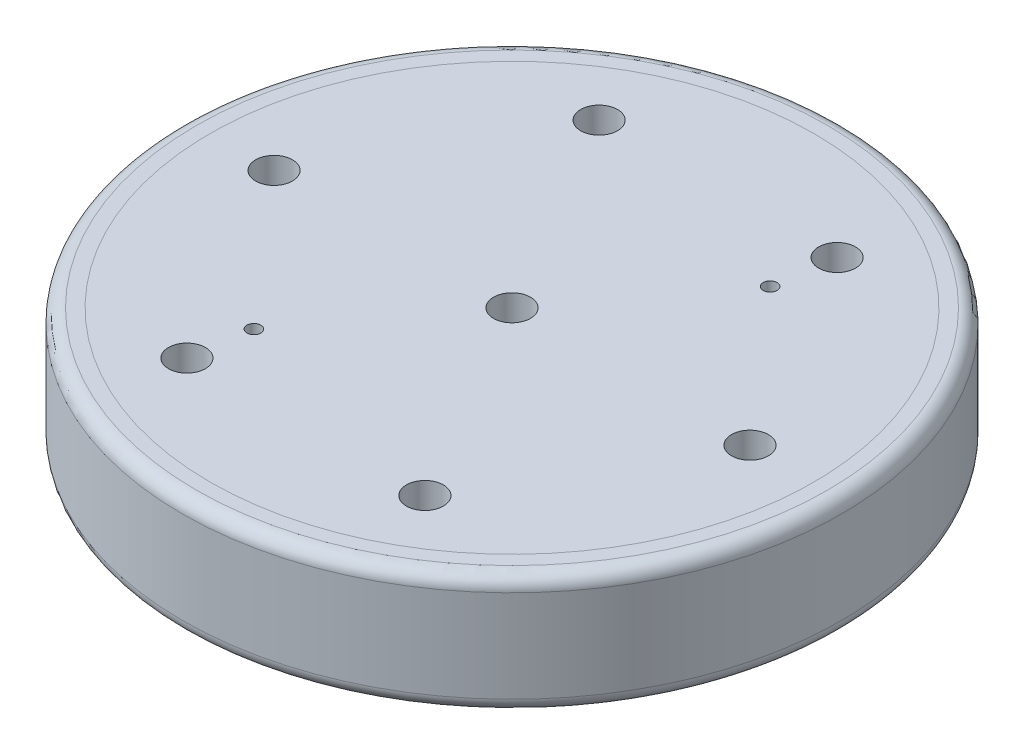
ISO-10303-21;
HEADER;
FILE_DESCRIPTION(('STEP AP214'),'2;1');
FILE_NAME('part.step','',(''),(''),'','','');
FILE_SCHEMA(('AUTOMOTIVE_DESIGN { 1 0 10303 214 1 1 1 1 }'));
ENDSEC;
DATA;
#1=APPLICATION_CONTEXT('core data for automotive mechanical design processes');
#2=APPLICATION_PROTOCOL_DEFINITION('international standard','automotive_design',2000,#1);
#3=PRODUCT_CONTEXT('',#1,'mechanical');
#4=PRODUCT('Part','Part','',(#3));
#5=PRODUCT_RELATED_PRODUCT_CATEGORY('part','',(#4));
#6=PRODUCT_DEFINITION_FORMATION('','',#4);
#7=PRODUCT_DEFINITION_CONTEXT('part definition',#1,'design');
#8=PRODUCT_DEFINITION('design','',#6,#7);
#9=PRODUCT_DEFINITION_SHAPE('','',#8);
#10=(LENGTH_UNIT() NAMED_UNIT(*) SI_UNIT(.MILLI.,.METRE.));
#11=(NAMED_UNIT(*) PLANE_ANGLE_UNIT() SI_UNIT($,.RADIAN.));
#12=(NAMED_UNIT(*) SI_UNIT($,.STERADIAN.) SOLID_ANGLE_UNIT());
#13=UNCERTAINTY_MEASURE_WITH_UNIT(LENGTH_MEASURE(1.E-05),#10,'distance_accuracy_value','');
#14=(GEOMETRIC_REPRESENTATION_CONTEXT(3) GLOBAL_UNCERTAINTY_ASSIGNED_CONTEXT((#13)) GLOBAL_UNIT_ASSIGNED_CONTEXT((#10,
#11,#12)) REPRESENTATION_CONTEXT('',''));
#15=CARTESIAN_POINT('',(0.,0.,0.));
#16=DIRECTION('',(0.,0.,1.));
#17=DIRECTION('',(1.,0.,0.));
#18=AXIS2_PLACEMENT_3D('',#15,#16,#17);
#19=CARTESIAN_POINT('',(0.,-10.,0.));
#20=DIRECTION('',(0.,1.,0.));
#21=DIRECTION('',(0.,0.,1.));
#22=AXIS2_PLACEMENT_3D('',#19,#20,#21);
#23=CYLINDRICAL_SURFACE('',#22,35.75);
#24=CARTESIAN_POINT('',(0.,-8.5,0.));
#25=DIRECTION('',(0.,1.,0.));
#26=DIRECTION('',(0.,0.,1.));
#27=AXIS2_PLACEMENT_3D('',#24,#25,#26);
#28=CIRCLE('',#27,35.75);
#29=CARTESIAN_POINT('',(0.,-8.5,35.75));
#30=VERTEX_POINT('',#29);
#31=EDGE_CURVE('E52',#30,#30,#28,.T.);
#32=CARTESIAN_POINT('',(0.,1.5,0.));
#33=DIRECTION('',(0.,1.,0.));
#34=DIRECTION('',(0.,0.,1.));
#35=AXIS2_PLACEMENT_3D('',#32,#33,#34);
#36=CIRCLE('',#35,35.75);
#37=CARTESIAN_POINT('',(0.,1.5,35.75));
#38=VERTEX_POINT('',#37);
#39=EDGE_CURVE('E56',#38,#38,#36,.F.);
#40=CARTESIAN_POINT('',(0.,-8.5,35.75));
#41=CARTESIAN_POINT('',(0.,-8.39583333333333,35.75));
#42=CARTESIAN_POINT('',(0.,-8.29166666666667,35.75));
#43=CARTESIAN_POINT('',(0.,-8.08333333333333,35.75));
#44=CARTESIAN_POINT('',(0.,-7.97916666666667,35.75));
#45=CARTESIAN_POINT('',(0.,-7.77083333333333,35.75));
#46=CARTESIAN_POINT('',(0.,-7.66666666666667,35.75));
#47=CARTESIAN_POINT('',(0.,-7.45833333333333,35.75));
#48=CARTESIAN_POINT('',(0.,-7.35416666666667,35.75));
#49=CARTESIAN_POINT('',(0.,-7.14583333333333,35.75));
#50=CARTESIAN_POINT('',(0.,-7.04166666666667,35.75));
#51=CARTESIAN_POINT('',(0.,-6.83333333333333,35.75));
#52=CARTESIAN_POINT('',(0.,-6.72916666666667,35.75));
#53=CARTESIAN_POINT('',(0.,-6.52083333333333,35.75));
#54=CARTESIAN_POINT('',(0.,-6.41666666666667,35.75));
#55=CARTESIAN_POINT('',(0.,-6.20833333333333,35.75));
#56=CARTESIAN_POINT('',(0.,-6.10416666666667,35.75));
#57=CARTESIAN_POINT('',(0.,-5.89583333333333,35.75));
#58=CARTESIAN_POINT('',(0.,-5.79166666666667,35.75));
#59=CARTESIAN_POINT('',(0.,-5.58333333333333,35.75));
#60=CARTESIAN_POINT('',(0.,-5.47916666666667,35.75));
#61=CARTESIAN_POINT('',(0.,-5.27083333333333,35.75));
#62=CARTESIAN_POINT('',(0.,-5.16666666666667,35.75));
#63=CARTESIAN_POINT('',(0.,-4.95833333333333,35.75));
#64=CARTESIAN_POINT('',(0.,-4.85416666666667,35.75));
#65=CARTESIAN_POINT('',(0.,-4.64583333333333,35.75));
#66=CARTESIAN_POINT('',(0.,-4.54166666666667,35.75));
#67=CARTESIAN_POINT('',(0.,-4.33333333333333,35.75));
#68=CARTESIAN_POINT('',(0.,-4.22916666666667,35.75));
#69=CARTESIAN_POINT('',(0.,-4.02083333333333,35.75));
#70=CARTESIAN_POINT('',(0.,-3.91666666666667,35.75));
#71=CARTESIAN_POINT('',(0.,-3.70833333333333,35.75));
#72=CARTESIAN_POINT('',(0.,-3.60416666666667,35.75));
#73=CARTESIAN_POINT('',(0.,-3.39583333333333,35.75));
#74=CARTESIAN_POINT('',(0.,-3.29166666666667,35.75));
#75=CARTESIAN_POINT('',(0.,-3.08333333333333,35.75));
#76=CARTESIAN_POINT('',(0.,-2.97916666666667,35.75));
#77=CARTESIAN_POINT('',(0.,-2.77083333333333,35.75));
#78=CARTESIAN_POINT('',(0.,-2.66666666666667,35.75));
#79=CARTESIAN_POINT('',(0.,-2.45833333333333,35.75));
#80=CARTESIAN_POINT('',(0.,-2.35416666666667,35.75));
#81=CARTESIAN_POINT('',(0.,-2.14583333333333,35.75));
#82=CARTESIAN_POINT('',(0.,-2.04166666666667,35.75));
#83=CARTESIAN_POINT('',(0.,-1.83333333333334,35.75));
#84=CARTESIAN_POINT('',(0.,-1.72916666666667,35.75));
#85=CARTESIAN_POINT('',(0.,-1.52083333333333,35.75));
#86=CARTESIAN_POINT('',(0.,-1.41666666666667,35.75));
#87=CARTESIAN_POINT('',(0.,-1.20833333333333,35.75));
#88=CARTESIAN_POINT('',(0.,-1.10416666666667,35.75));
#89=CARTESIAN_POINT('',(0.,-0.895833333333334,35.75));
#90=CARTESIAN_POINT('',(0.,-0.791666666666667,35.75));
#91=CARTESIAN_POINT('',(0.,-0.583333333333334,35.75));
#92=CARTESIAN_POINT('',(0.,-0.479166666666667,35.75));
#93=CARTESIAN_POINT('',(0.,-0.270833333333334,35.75));
#94=CARTESIAN_POINT('',(0.,-0.166666666666667,35.75));
#95=CARTESIAN_POINT('',(0.,0.0416666666666667,35.75));
#96=CARTESIAN_POINT('',(0.,0.145833333333333,35.75));
#97=CARTESIAN_POINT('',(0.,0.354166666666666,35.75));
#98=CARTESIAN_POINT('',(0.,0.458333333333333,35.75));
#99=CARTESIAN_POINT('',(0.,0.666666666666666,35.75));
#100=CARTESIAN_POINT('',(0.,0.770833333333332,35.75));
#101=CARTESIAN_POINT('',(0.,0.979166666666666,35.75));
#102=CARTESIAN_POINT('',(0.,1.08333333333333,35.75));
#103=CARTESIAN_POINT('',(0.,1.29166666666667,35.75));
#104=CARTESIAN_POINT('',(0.,1.39583333333333,35.75));
#105=CARTESIAN_POINT('',(0.,1.5,35.75));
#106=B_SPLINE_CURVE_WITH_KNOTS('',3,(#40,#41,#42,#43,#44,#45,#46,#47,#48,#49,#50,#51,#52,#53,
#54,#55,#56,#57,#58,#59,#60,#61,#62,#63,#64,#65,#66,#67,#68,#69,#70,#71,#72,#73,#74,#75,#76,#77,
#78,#79,#80,#81,#82,#83,#84,#85,#86,#87,#88,#89,#90,#91,#92,#93,#94,#95,#96,#97,#98,#99,#100,
#101,#102,#103,#104,#105),.UNSPECIFIED.,.F.,.F.,(4,2,2,2,2,2,2,2,2,2,2,2,2,2,2,2,2,2,2,2,2,2,2,
2,2,2,2,2,2,2,2,2,4),(0.,0.312499999999999,0.624999999999999,0.937499999999999,1.25,1.5625,
1.875,2.1875,2.5,2.8125,3.125,3.4375,3.75,4.0625,4.375,4.6875,5.,5.3125,5.625,5.9375,6.25,
6.5625,6.875,7.1875,7.5,7.8125,8.125,8.4375,8.75,9.0625,9.375,9.6875,10.),.UNSPECIFIED.);
#107=EDGE_CURVE('BSEAM44',#30,#38,#106,.T.);
#108=ORIENTED_EDGE('',*,*,#31,.T.);
#109=ORIENTED_EDGE('',*,*,#39,.T.);
#110=ORIENTED_EDGE('',*,*,#107,.T.);
#111=ORIENTED_EDGE('',*,*,#107,.F.);
#112=EDGE_LOOP('',(#108,#110,#109,#111));
#113=FACE_BOUND('',#112,.T.);
#114=ADVANCED_FACE('F44',(#113),#23,.T.);
#115=CARTESIAN_POINT('',(0.,3.,0.));
#116=DIRECTION('',(0.,1.,0.));
#117=DIRECTION('',(0.,0.,1.));
#118=AXIS2_PLACEMENT_3D('',#115,#116,#117);
#119=PLANE('',#118);
#120=CARTESIAN_POINT('',(0.,3.,0.));
#121=DIRECTION('',(0.,1.,0.));
#122=DIRECTION('',(0.,0.,1.));
#123=AXIS2_PLACEMENT_3D('',#120,#121,#122);
#124=CIRCLE('',#123,34.25);
#125=CARTESIAN_POINT('',(0.,3.,34.25));
#126=VERTEX_POINT('',#125);
#127=EDGE_CURVE('E12',#126,#126,#124,.T.);
#128=ORIENTED_EDGE('',*,*,#127,.T.);
#129=EDGE_LOOP('',(#128));
#130=FACE_BOUND('',#129,.T.);
#131=CARTESIAN_POINT('',(0.,3.,0.));
#132=DIRECTION('',(0.,1.,0.));
#133=DIRECTION('',(0.,0.,1.));
#134=AXIS2_PLACEMENT_3D('',#131,#132,#133);
#135=CIRCLE('',#134,32.75);
#136=CARTESIAN_POINT('',(0.,3.,32.75));
#137=VERTEX_POINT('',#136);
#138=EDGE_CURVE('E64',#137,#137,#135,.T.);
#139=ORIENTED_EDGE('',*,*,#138,.F.);
#140=EDGE_LOOP('',(#139));
#141=FACE_BOUND('',#140,.T.);
#142=ADVANCED_FACE('F84',(#130,#141),#119,.T.);
#143=CARTESIAN_POINT('',(0.,-10.,0.));
#144=DIRECTION('',(0.,1.,0.));
#145=DIRECTION('',(0.,0.,1.));
#146=AXIS2_PLACEMENT_3D('',#143,#144,#145);
#147=CYLINDRICAL_SURFACE('',#146,32.75);
#148=CARTESIAN_POINT('',(0.,-8.5,0.));
#149=DIRECTION('',(0.,1.,0.));
#150=DIRECTION('',(0.,0.,1.));
#151=AXIS2_PLACEMENT_3D('',#148,#149,#150);
#152=CIRCLE('',#151,32.75);
#153=CARTESIAN_POINT('',(0.,-8.5,32.75));
#154=VERTEX_POINT('',#153);
#155=EDGE_CURVE('E61',#154,#154,#152,.F.);
#156=CARTESIAN_POINT('',(0.,-8.5,32.75));
#157=CARTESIAN_POINT('',(0.,-8.38020833333333,32.75));
#158=CARTESIAN_POINT('',(0.,-8.26041666666667,32.75));
#159=CARTESIAN_POINT('',(0.,-8.02083333333333,32.75));
#160=CARTESIAN_POINT('',(0.,-7.90104166666667,32.75));
#161=CARTESIAN_POINT('',(0.,-7.66145833333333,32.75));
#162=CARTESIAN_POINT('',(0.,-7.54166666666667,32.75));
#163=CARTESIAN_POINT('',(0.,-7.30208333333333,32.75));
#164=CARTESIAN_POINT('',(0.,-7.18229166666667,32.75));
#165=CARTESIAN_POINT('',(0.,-6.94270833333333,32.75));
#166=CARTESIAN_POINT('',(0.,-6.82291666666667,32.75));
#167=CARTESIAN_POINT('',(0.,-6.58333333333333,32.75));
#168=CARTESIAN_POINT('',(0.,-6.46354166666667,32.75));
#169=CARTESIAN_POINT('',(0.,-6.22395833333333,32.75));
#170=CARTESIAN_POINT('',(0.,-6.10416666666667,32.75));
#171=CARTESIAN_POINT('',(0.,-5.86458333333333,32.75));
#172=CARTESIAN_POINT('',(0.,-5.74479166666667,32.75));
#173=CARTESIAN_POINT('',(0.,-5.50520833333333,32.75));
#174=CARTESIAN_POINT('',(0.,-5.38541666666667,32.75));
#175=CARTESIAN_POINT('',(0.,-5.14583333333333,32.75));
#176=CARTESIAN_POINT('',(0.,-5.02604166666667,32.75));
#177=CARTESIAN_POINT('',(0.,-4.78645833333333,32.75));
#178=CARTESIAN_POINT('',(0.,-4.66666666666667,32.75));
#179=CARTESIAN_POINT('',(0.,-4.42708333333333,32.75));
#180=CARTESIAN_POINT('',(0.,-4.30729166666667,32.75));
#181=CARTESIAN_POINT('',(0.,-4.06770833333333,32.75));
#182=CARTESIAN_POINT('',(0.,-3.94791666666667,32.75));
#183=CARTESIAN_POINT('',(0.,-3.70833333333333,32.75));
#184=CARTESIAN_POINT('',(0.,-3.58854166666667,32.75));
#185=CARTESIAN_POINT('',(0.,-3.34895833333333,32.75));
#186=CARTESIAN_POINT('',(0.,-3.22916666666667,32.75));
#187=CARTESIAN_POINT('',(0.,-2.98958333333333,32.75));
#188=CARTESIAN_POINT('',(0.,-2.86979166666667,32.75));
#189=CARTESIAN_POINT('',(0.,-2.63020833333333,32.75));
#190=CARTESIAN_POINT('',(0.,-2.51041666666667,32.75));
#191=CARTESIAN_POINT('',(0.,-2.27083333333333,32.75));
#192=CARTESIAN_POINT('',(0.,-2.15104166666667,32.75));
#193=CARTESIAN_POINT('',(0.,-1.91145833333333,32.75));
#194=CARTESIAN_POINT('',(0.,-1.79166666666667,32.75));
#195=CARTESIAN_POINT('',(0.,-1.55208333333333,32.75));
#196=CARTESIAN_POINT('',(0.,-1.43229166666667,32.75));
#197=CARTESIAN_POINT('',(0.,-1.19270833333333,32.75));
#198=CARTESIAN_POINT('',(0.,-1.07291666666667,32.75));
#199=CARTESIAN_POINT('',(0.,-0.833333333333333,32.75));
#200=CARTESIAN_POINT('',(0.,-0.713541666666666,32.75));
#201=CARTESIAN_POINT('',(0.,-0.473958333333333,32.75));
#202=CARTESIAN_POINT('',(0.,-0.354166666666666,32.75));
#203=CARTESIAN_POINT('',(0.,-0.114583333333333,32.75));
#204=CARTESIAN_POINT('',(0.,0.00520833333333337,32.75));
#205=CARTESIAN_POINT('',(0.,0.244791666666667,32.75));
#206=CARTESIAN_POINT('',(0.,0.364583333333334,32.75));
#207=CARTESIAN_POINT('',(0.,0.604166666666667,32.75));
#208=CARTESIAN_POINT('',(0.,0.723958333333334,32.75));
#209=CARTESIAN_POINT('',(0.,0.963541666666667,32.75));
#210=CARTESIAN_POINT('',(0.,1.08333333333333,32.75));
#211=CARTESIAN_POINT('',(0.,1.32291666666667,32.75));
#212=CARTESIAN_POINT('',(0.,1.44270833333333,32.75));
#213=CARTESIAN_POINT('',(0.,1.68229166666667,32.75));
#214=CARTESIAN_POINT('',(0.,1.80208333333333,32.75));
#215=CARTESIAN_POINT('',(0.,2.04166666666667,32.75));
#216=CARTESIAN_POINT('',(0.,2.16145833333333,32.75));
#217=CARTESIAN_POINT('',(0.,2.40104166666667,32.75));
#218=CARTESIAN_POINT('',(0.,2.52083333333333,32.75));
#219=CARTESIAN_POINT('',(0.,2.76041666666667,32.75));
#220=CARTESIAN_POINT('',(0.,2.88020833333333,32.75));
#221=CARTESIAN_POINT('',(0.,3.,32.75));
#222=B_SPLINE_CURVE_WITH_KNOTS('',3,(#156,#157,#158,#159,#160,#161,#162,#163,#164,#165,#166,
#167,#168,#169,#170,#171,#172,#173,#174,#175,#176,#177,#178,#179,#180,#181,#182,#183,#184,#185,
#186,#187,#188,#189,#190,#191,#192,#193,#194,#195,#196,#197,#198,#199,#200,#201,#202,#203,#204,
#205,#206,#207,#208,#209,#210,#211,#212,#213,#214,#215,#216,#217,#218,#219,#220,#221),
.UNSPECIFIED.,.F.,.F.,(4,2,2,2,2,2,2,2,2,2,2,2,2,2,2,2,2,2,2,2,2,2,2,2,2,2,2,2,2,2,2,2,4),(0.,
0.359375,0.718749999999999,1.078125,1.4375,1.796875,2.15625,2.515625,2.875,3.234375,3.59375,
3.953125,4.3125,4.671875,5.03125,5.390625,5.75,6.109375,6.46875,6.828125,7.1875,7.546875,
7.90625,8.265625,8.625,8.984375,9.34375,9.703125,10.0625,10.421875,10.78125,11.140625,11.5),.UNSPECIFIED.);
#223=EDGE_CURVE('BSEAM75',#154,#137,#222,.T.);
#224=ORIENTED_EDGE('',*,*,#155,.T.);
#225=ORIENTED_EDGE('',*,*,#138,.T.);
#226=ORIENTED_EDGE('',*,*,#223,.T.);
#227=ORIENTED_EDGE('',*,*,#223,.F.);
#228=EDGE_LOOP('',(#224,#226,#225,#227));
#229=FACE_BOUND('',#228,.T.);
#230=ADVANCED_FACE('F75',(#229),#147,.F.);
#231=CARTESIAN_POINT('',(0.,-8.5,0.));
#232=DIRECTION('',(0.,1.,0.));
#233=DIRECTION('',(0.,0.,1.));
#234=AXIS2_PLACEMENT_3D('',#231,#232,#233);
#235=TOROIDAL_SURFACE('',#234,34.25,1.5);
#236=ORIENTED_EDGE('',*,*,#31,.F.);
#237=EDGE_LOOP('',(#236));
#238=FACE_BOUND('',#237,.T.);
#239=CARTESIAN_POINT('',(0.,-10.,0.));
#240=DIRECTION('',(0.,1.,0.));
#241=DIRECTION('',(0.,0.,1.));
#242=AXIS2_PLACEMENT_3D('',#239,#240,#241);
#243=CIRCLE('',#242,34.25);
#244=CARTESIAN_POINT('',(0.,-10.,34.25));
#245=VERTEX_POINT('',#244);
#246=EDGE_CURVE('E48',#245,#245,#243,.F.);
#247=ORIENTED_EDGE('',*,*,#246,.F.);
#248=EDGE_LOOP('',(#247));
#249=FACE_BOUND('',#248,.T.);
#250=ADVANCED_FACE('F73',(#238,#249),#235,.T.);
#251=CARTESIAN_POINT('',(0.,-8.5,0.));
#252=DIRECTION('',(0.,1.,0.));
#253=DIRECTION('',(0.,0.,1.));
#254=AXIS2_PLACEMENT_3D('',#251,#252,#253);
#255=TOROIDAL_SURFACE('',#254,34.25,1.5);
#256=ORIENTED_EDGE('',*,*,#155,.F.);
#257=EDGE_LOOP('',(#256));
#258=FACE_BOUND('',#257,.T.);
#259=ORIENTED_EDGE('',*,*,#246,.T.);
#260=EDGE_LOOP('',(#259));
#261=FACE_BOUND('',#260,.T.);
#262=ADVANCED_FACE('F71',(#258,#261),#255,.T.);
#263=CARTESIAN_POINT('',(0.,1.5,0.));
#264=DIRECTION('',(0.,1.,0.));
#265=DIRECTION('',(0.,0.,1.));
#266=AXIS2_PLACEMENT_3D('',#263,#264,#265);
#267=TOROIDAL_SURFACE('',#266,34.25,1.5);
#268=ORIENTED_EDGE('',*,*,#39,.F.);
#269=EDGE_LOOP('',(#268));
#270=FACE_BOUND('',#269,.T.);
#271=ORIENTED_EDGE('',*,*,#127,.F.);
#272=EDGE_LOOP('',(#271));
#273=FACE_BOUND('',#272,.T.);
#274=ADVANCED_FACE('F46',(#270,#273),#267,.T.);
#275=CLOSED_SHELL('',(#114,#142,#230,#250,#262,#274));
#276=MANIFOLD_SOLID_BREP('B2',#275);
#277=CARTESIAN_POINT('',(0.,3.,0.));
#278=DIRECTION('',(0.,1.,0.));
#279=DIRECTION('',(0.,0.,1.));
#280=AXIS2_PLACEMENT_3D('',#277,#278,#279);
#281=PLANE('',#280);
#282=CARTESIAN_POINT('',(12.,3.,-16.));
#283=DIRECTION('',(0.,1.,0.));
#284=DIRECTION('',(0.,0.,1.));
#285=AXIS2_PLACEMENT_3D('',#282,#283,#284);
#286=CIRCLE('',#285,0.75);
#287=CARTESIAN_POINT('',(12.,3.,-15.25));
#288=VERTEX_POINT('',#287);
#289=EDGE_CURVE('E182',#288,#288,#286,.T.);
#290=ORIENTED_EDGE('',*,*,#289,.F.);
#291=EDGE_LOOP('',(#290));
#292=FACE_BOUND('',#291,.T.);
#293=CARTESIAN_POINT('',(-12.,3.,16.));
#294=DIRECTION('',(0.,1.,0.));
#295=DIRECTION('',(0.,0.,1.));
#296=AXIS2_PLACEMENT_3D('',#293,#294,#295);
#297=CIRCLE('',#296,0.75);
#298=CARTESIAN_POINT('',(-12.,3.,16.75));
#299=VERTEX_POINT('',#298);
#300=EDGE_CURVE('E187',#299,#299,#297,.T.);
#301=ORIENTED_EDGE('',*,*,#300,.F.);
#302=EDGE_LOOP('',(#301));
#303=FACE_BOUND('',#302,.T.);
#304=CARTESIAN_POINT('',(12.907029535,3.,22.3556309294121));
#305=DIRECTION('',(0.,1.,0.));
#306=DIRECTION('',(0.,0.,1.));
#307=AXIS2_PLACEMENT_3D('',#304,#305,#306);
#308=CIRCLE('',#307,2.00000000000019);
#309=CARTESIAN_POINT('',(12.907029535,3.,24.3556309294123));
#310=VERTEX_POINT('',#309);
#311=EDGE_CURVE('E179',#310,#310,#308,.T.);
#312=ORIENTED_EDGE('',*,*,#311,.F.);
#313=EDGE_LOOP('',(#312));
#314=FACE_BOUND('',#313,.T.);
#315=CARTESIAN_POINT('',(-12.907029535,3.,-22.3556309294121));
#316=DIRECTION('',(0.,1.,0.));
#317=DIRECTION('',(0.,0.,1.));
#318=AXIS2_PLACEMENT_3D('',#315,#316,#317);
#319=CIRCLE('',#318,1.99999999999982);
#320=CARTESIAN_POINT('',(-12.907029535,3.,-20.3556309294123));
#321=VERTEX_POINT('',#320);
#322=EDGE_CURVE('E164',#321,#321,#319,.F.);
#323=ORIENTED_EDGE('',*,*,#322,.T.);
#324=EDGE_LOOP('',(#323));
#325=FACE_BOUND('',#324,.T.);
#326=CARTESIAN_POINT('',(0.,3.,0.));
#327=DIRECTION('',(0.,1.,0.));
#328=DIRECTION('',(0.,0.,1.));
#329=AXIS2_PLACEMENT_3D('',#326,#327,#328);
#330=CIRCLE('',#329,32.75);
#331=CARTESIAN_POINT('',(0.,3.,32.75));
#332=VERTEX_POINT('',#331);
#333=EDGE_CURVE('E43',#332,#332,#330,.T.);
#334=ORIENTED_EDGE('',*,*,#333,.T.);
#335=EDGE_LOOP('',(#334));
#336=FACE_BOUND('',#335,.T.);
#337=CARTESIAN_POINT('',(0.,3.,0.));
#338=DIRECTION('',(0.,1.,0.));
#339=DIRECTION('',(0.,0.,1.));
#340=AXIS2_PLACEMENT_3D('',#337,#338,#339);
#341=CIRCLE('',#340,2.);
#342=CARTESIAN_POINT('',(0.,3.,2.));
#343=VERTEX_POINT('',#342);
#344=EDGE_CURVE('E152',#343,#343,#341,.T.);
#345=ORIENTED_EDGE('',*,*,#344,.F.);
#346=EDGE_LOOP('',(#345));
#347=FACE_BOUND('',#346,.T.);
#348=CARTESIAN_POINT('',(-25.81405907,3.,0.));
#349=DIRECTION('',(0.,1.,0.));
#350=DIRECTION('',(0.,0.,1.));
#351=AXIS2_PLACEMENT_3D('',#348,#349,#350);
#352=CIRCLE('',#351,2.);
#353=CARTESIAN_POINT('',(-25.81405907,3.,2.));
#354=VERTEX_POINT('',#353);
#355=EDGE_CURVE('E160',#354,#354,#352,.F.);
#356=ORIENTED_EDGE('',*,*,#355,.T.);
#357=EDGE_LOOP('',(#356));
#358=FACE_BOUND('',#357,.T.);
#359=CARTESIAN_POINT('',(12.907029535,3.,-22.3556309294121));
#360=DIRECTION('',(0.,1.,0.));
#361=DIRECTION('',(0.,0.,1.));
#362=AXIS2_PLACEMENT_3D('',#359,#360,#361);
#363=CIRCLE('',#362,2.00000000000024);
#364=CARTESIAN_POINT('',(12.907029535,3.,-20.3556309294119));
#365=VERTEX_POINT('',#364);
#366=EDGE_CURVE('E168',#365,#365,#363,.T.);
#367=ORIENTED_EDGE('',*,*,#366,.F.);
#368=EDGE_LOOP('',(#367));
#369=FACE_BOUND('',#368,.T.);
#370=CARTESIAN_POINT('',(25.81405907,3.,0.));
#371=DIRECTION('',(0.,1.,0.));
#372=DIRECTION('',(0.,0.,1.));
#373=AXIS2_PLACEMENT_3D('',#370,#371,#372);
#374=CIRCLE('',#373,2.);
#375=CARTESIAN_POINT('',(25.81405907,3.,1.99999999999999));
#376=VERTEX_POINT('',#375);
#377=EDGE_CURVE('E172',#376,#376,#374,.T.);
#378=ORIENTED_EDGE('',*,*,#377,.F.);
#379=EDGE_LOOP('',(#378));
#380=FACE_BOUND('',#379,.T.);
#381=CARTESIAN_POINT('',(-12.907029535,3.,22.3556309294121));
#382=DIRECTION('',(0.,1.,0.));
#383=DIRECTION('',(0.,0.,1.));
#384=AXIS2_PLACEMENT_3D('',#381,#382,#383);
#385=CIRCLE('',#384,1.99999999999976);
#386=CARTESIAN_POINT('',(-12.907029535,3.,24.3556309294119));
#387=VERTEX_POINT('',#386);
#388=EDGE_CURVE('E176',#387,#387,#385,.F.);
#389=ORIENTED_EDGE('',*,*,#388,.T.);
#390=EDGE_LOOP('',(#389));
#391=FACE_BOUND('',#390,.T.);
#392=ADVANCED_FACE('F136',(#292,#303,#314,#325,#336,#347,#358,#369,#380,#391),#281,.T.);
#393=CARTESIAN_POINT('',(0.,0.,0.));
#394=DIRECTION('',(0.,1.,0.));
#395=DIRECTION('',(0.,0.,1.));
#396=AXIS2_PLACEMENT_3D('',#393,#394,#395);
#397=PLANE('',#396);
#398=CARTESIAN_POINT('',(12.,0.,-16.));
#399=DIRECTION('',(0.,1.,0.));
#400=DIRECTION('',(0.,0.,1.));
#401=AXIS2_PLACEMENT_3D('',#398,#399,#400);
#402=CIRCLE('',#401,0.75);
#403=CARTESIAN_POINT('',(12.,0.,-15.25));
#404=VERTEX_POINT('',#403);
#405=EDGE_CURVE('E140',#404,#404,#402,.T.);
#406=ORIENTED_EDGE('',*,*,#405,.T.);
#407=EDGE_LOOP('',(#406));
#408=FACE_BOUND('',#407,.T.);
#409=CARTESIAN_POINT('',(-12.,0.,16.));
#410=DIRECTION('',(0.,1.,0.));
#411=DIRECTION('',(0.,0.,1.));
#412=AXIS2_PLACEMENT_3D('',#409,#410,#411);
#413=CIRCLE('',#412,0.75);
#414=CARTESIAN_POINT('',(-12.,0.,16.75));
#415=VERTEX_POINT('',#414);
#416=EDGE_CURVE('E180',#415,#415,#413,.T.);
#417=ORIENTED_EDGE('',*,*,#416,.T.);
#418=EDGE_LOOP('',(#417));
#419=FACE_BOUND('',#418,.T.);
#420=CARTESIAN_POINT('',(12.907029535,0.,22.3556309294121));
#421=DIRECTION('',(0.,1.,0.));
#422=DIRECTION('',(0.,0.,1.));
#423=AXIS2_PLACEMENT_3D('',#420,#421,#422);
#424=CIRCLE('',#423,2.00000000000019);
#425=CARTESIAN_POINT('',(12.907029535,0.,24.3556309294123));
#426=VERTEX_POINT('',#425);
#427=EDGE_CURVE('E177',#426,#426,#424,.T.);
#428=ORIENTED_EDGE('',*,*,#427,.T.);
#429=EDGE_LOOP('',(#428));
#430=FACE_BOUND('',#429,.T.);
#431=CARTESIAN_POINT('',(-12.907029535,0.,-22.3556309294121));
#432=DIRECTION('',(0.,1.,0.));
#433=DIRECTION('',(0.,0.,1.));
#434=AXIS2_PLACEMENT_3D('',#431,#432,#433);
#435=CIRCLE('',#434,1.99999999999982);
#436=CARTESIAN_POINT('',(-12.907029535,0.,-20.3556309294123));
#437=VERTEX_POINT('',#436);
#438=EDGE_CURVE('E161',#437,#437,#435,.F.);
#439=ORIENTED_EDGE('',*,*,#438,.F.);
#440=EDGE_LOOP('',(#439));
#441=FACE_BOUND('',#440,.T.);
#442=CARTESIAN_POINT('',(0.,0.,0.));
#443=DIRECTION('',(0.,1.,0.));
#444=DIRECTION('',(0.,0.,1.));
#445=AXIS2_PLACEMENT_3D('',#442,#443,#444);
#446=CIRCLE('',#445,32.75);
#447=CARTESIAN_POINT('',(0.,0.,32.75));
#448=VERTEX_POINT('',#447);
#449=EDGE_CURVE('E144',#448,#448,#446,.T.);
#450=ORIENTED_EDGE('',*,*,#449,.F.);
#451=EDGE_LOOP('',(#450));
#452=FACE_BOUND('',#451,.T.);
#453=CARTESIAN_POINT('',(0.,0.,0.));
#454=DIRECTION('',(0.,1.,0.));
#455=DIRECTION('',(0.,0.,1.));
#456=AXIS2_PLACEMENT_3D('',#453,#454,#455);
#457=CIRCLE('',#456,2.);
#458=CARTESIAN_POINT('',(0.,0.,2.));
#459=VERTEX_POINT('',#458);
#460=EDGE_CURVE('E149',#459,#459,#457,.T.);
#461=ORIENTED_EDGE('',*,*,#460,.T.);
#462=EDGE_LOOP('',(#461));
#463=FACE_BOUND('',#462,.T.);
#464=CARTESIAN_POINT('',(-25.81405907,0.,0.));
#465=DIRECTION('',(0.,1.,0.));
#466=DIRECTION('',(0.,0.,1.));
#467=AXIS2_PLACEMENT_3D('',#464,#465,#466);
#468=CIRCLE('',#467,2.);
#469=CARTESIAN_POINT('',(-25.81405907,0.,2.));
#470=VERTEX_POINT('',#469);
#471=EDGE_CURVE('E157',#470,#470,#468,.F.);
#472=ORIENTED_EDGE('',*,*,#471,.F.);
#473=EDGE_LOOP('',(#472));
#474=FACE_BOUND('',#473,.T.);
#475=CARTESIAN_POINT('',(12.907029535,0.,-22.3556309294121));
#476=DIRECTION('',(0.,1.,0.));
#477=DIRECTION('',(0.,0.,1.));
#478=AXIS2_PLACEMENT_3D('',#475,#476,#477);
#479=CIRCLE('',#478,2.00000000000024);
#480=CARTESIAN_POINT('',(12.907029535,0.,-20.3556309294119));
#481=VERTEX_POINT('',#480);
#482=EDGE_CURVE('E165',#481,#481,#479,.T.);
#483=ORIENTED_EDGE('',*,*,#482,.T.);
#484=EDGE_LOOP('',(#483));
#485=FACE_BOUND('',#484,.T.);
#486=CARTESIAN_POINT('',(25.81405907,0.,0.));
#487=DIRECTION('',(0.,1.,0.));
#488=DIRECTION('',(0.,0.,1.));
#489=AXIS2_PLACEMENT_3D('',#486,#487,#488);
#490=CIRCLE('',#489,2.);
#491=CARTESIAN_POINT('',(25.81405907,0.,1.99999999999999));
#492=VERTEX_POINT('',#491);
#493=EDGE_CURVE('E169',#492,#492,#490,.T.);
#494=ORIENTED_EDGE('',*,*,#493,.T.);
#495=EDGE_LOOP('',(#494));
#496=FACE_BOUND('',#495,.T.);
#497=CARTESIAN_POINT('',(-12.907029535,0.,22.3556309294121));
#498=DIRECTION('',(0.,1.,0.));
#499=DIRECTION('',(0.,0.,1.));
#500=AXIS2_PLACEMENT_3D('',#497,#498,#499);
#501=CIRCLE('',#500,1.99999999999976);
#502=CARTESIAN_POINT('',(-12.907029535,0.,24.3556309294119));
#503=VERTEX_POINT('',#502);
#504=EDGE_CURVE('E173',#503,#503,#501,.F.);
#505=ORIENTED_EDGE('',*,*,#504,.F.);
#506=EDGE_LOOP('',(#505));
#507=FACE_BOUND('',#506,.T.);
#508=ADVANCED_FACE('F216',(#408,#419,#430,#441,#452,#463,#474,#485,#496,#507),#397,.F.);
#509=CARTESIAN_POINT('',(0.,3.,0.));
#510=DIRECTION('',(0.,-1.,0.));
#511=DIRECTION('',(0.,0.,-1.));
#512=AXIS2_PLACEMENT_3D('',#509,#510,#511);
#513=CYLINDRICAL_SURFACE('',#512,32.75);
#514=ORIENTED_EDGE('',*,*,#333,.F.);
#515=EDGE_LOOP('',(#514));
#516=FACE_BOUND('',#515,.T.);
#517=ORIENTED_EDGE('',*,*,#449,.T.);
#518=EDGE_LOOP('',(#517));
#519=FACE_BOUND('',#518,.T.);
#520=ADVANCED_FACE('F138',(#516,#519),#513,.T.);
#521=CARTESIAN_POINT('',(0.,-1.,0.));
#522=DIRECTION('',(0.,1.,0.));
#523=DIRECTION('',(0.,0.,1.));
#524=AXIS2_PLACEMENT_3D('',#521,#522,#523);
#525=CYLINDRICAL_SURFACE('',#524,2.);
#526=ORIENTED_EDGE('',*,*,#344,.T.);
#527=EDGE_LOOP('',(#526));
#528=FACE_BOUND('',#527,.T.);
#529=ORIENTED_EDGE('',*,*,#460,.F.);
#530=EDGE_LOOP('',(#529));
#531=FACE_BOUND('',#530,.T.);
#532=ADVANCED_FACE('F212',(#528,#531),#525,.F.);
#533=CARTESIAN_POINT('',(-25.81405907,-7.,0.));
#534=DIRECTION('',(0.,1.,0.));
#535=DIRECTION('',(0.,0.,1.));
#536=AXIS2_PLACEMENT_3D('',#533,#534,#535);
#537=CYLINDRICAL_SURFACE('',#536,2.);
#538=ORIENTED_EDGE('',*,*,#355,.F.);
#539=EDGE_LOOP('',(#538));
#540=FACE_BOUND('',#539,.T.);
#541=ORIENTED_EDGE('',*,*,#471,.T.);
#542=EDGE_LOOP('',(#541));
#543=FACE_BOUND('',#542,.T.);
#544=ADVANCED_FACE('F208',(#540,#543),#537,.F.);
#545=CARTESIAN_POINT('',(-12.907029535,-7.,-22.3556309294121));
#546=DIRECTION('',(0.,1.,0.));
#547=DIRECTION('',(0.,0.,1.));
#548=AXIS2_PLACEMENT_3D('',#545,#546,#547);
#549=CYLINDRICAL_SURFACE('',#548,1.99999999999982);
#550=ORIENTED_EDGE('',*,*,#322,.F.);
#551=EDGE_LOOP('',(#550));
#552=FACE_BOUND('',#551,.T.);
#553=ORIENTED_EDGE('',*,*,#438,.T.);
#554=EDGE_LOOP('',(#553));
#555=FACE_BOUND('',#554,.T.);
#556=ADVANCED_FACE('F211',(#552,#555),#549,.F.);
#557=CARTESIAN_POINT('',(12.907029535,-7.,-22.3556309294121));
#558=DIRECTION('',(0.,1.,0.));
#559=DIRECTION('',(0.,0.,1.));
#560=AXIS2_PLACEMENT_3D('',#557,#558,#559);
#561=CYLINDRICAL_SURFACE('',#560,2.00000000000024);
#562=ORIENTED_EDGE('',*,*,#366,.T.);
#563=EDGE_LOOP('',(#562));
#564=FACE_BOUND('',#563,.T.);
#565=ORIENTED_EDGE('',*,*,#482,.F.);
#566=EDGE_LOOP('',(#565));
#567=FACE_BOUND('',#566,.T.);
#568=ADVANCED_FACE('F239',(#564,#567),#561,.F.);
#569=CARTESIAN_POINT('',(25.81405907,-7.,0.));
#570=DIRECTION('',(0.,1.,0.));
#571=DIRECTION('',(0.,0.,1.));
#572=AXIS2_PLACEMENT_3D('',#569,#570,#571);
#573=CYLINDRICAL_SURFACE('',#572,2.);
#574=ORIENTED_EDGE('',*,*,#377,.T.);
#575=EDGE_LOOP('',(#574));
#576=FACE_BOUND('',#575,.T.);
#577=ORIENTED_EDGE('',*,*,#493,.F.);
#578=EDGE_LOOP('',(#577));
#579=FACE_BOUND('',#578,.T.);
#580=ADVANCED_FACE('F229',(#576,#579),#573,.F.);
#581=CARTESIAN_POINT('',(-12.907029535,-7.,22.3556309294121));
#582=DIRECTION('',(0.,1.,0.));
#583=DIRECTION('',(0.,0.,1.));
#584=AXIS2_PLACEMENT_3D('',#581,#582,#583);
#585=CYLINDRICAL_SURFACE('',#584,1.99999999999976);
#586=ORIENTED_EDGE('',*,*,#388,.F.);
#587=EDGE_LOOP('',(#586));
#588=FACE_BOUND('',#587,.T.);
#589=ORIENTED_EDGE('',*,*,#504,.T.);
#590=EDGE_LOOP('',(#589));
#591=FACE_BOUND('',#590,.T.);
#592=ADVANCED_FACE('F226',(#588,#591),#585,.F.);
#593=CARTESIAN_POINT('',(12.907029535,-7.,22.3556309294121));
#594=DIRECTION('',(0.,1.,0.));
#595=DIRECTION('',(0.,0.,1.));
#596=AXIS2_PLACEMENT_3D('',#593,#594,#595);
#597=CYLINDRICAL_SURFACE('',#596,2.00000000000019);
#598=ORIENTED_EDGE('',*,*,#311,.T.);
#599=EDGE_LOOP('',(#598));
#600=FACE_BOUND('',#599,.T.);
#601=ORIENTED_EDGE('',*,*,#427,.F.);
#602=EDGE_LOOP('',(#601));
#603=FACE_BOUND('',#602,.T.);
#604=ADVANCED_FACE('F228',(#600,#603),#597,.F.);
#605=CARTESIAN_POINT('',(-12.,-7.,16.));
#606=DIRECTION('',(0.,1.,0.));
#607=DIRECTION('',(0.,0.,1.));
#608=AXIS2_PLACEMENT_3D('',#605,#606,#607);
#609=CYLINDRICAL_SURFACE('',#608,0.75);
#610=ORIENTED_EDGE('',*,*,#300,.T.);
#611=EDGE_LOOP('',(#610));
#612=FACE_BOUND('',#611,.T.);
#613=ORIENTED_EDGE('',*,*,#416,.F.);
#614=EDGE_LOOP('',(#613));
#615=FACE_BOUND('',#614,.T.);
#616=ADVANCED_FACE('F236',(#612,#615),#609,.F.);
#617=CARTESIAN_POINT('',(12.,-7.,-16.));
#618=DIRECTION('',(0.,1.,0.));
#619=DIRECTION('',(0.,0.,1.));
#620=AXIS2_PLACEMENT_3D('',#617,#618,#619);
#621=CYLINDRICAL_SURFACE('',#620,0.75);
#622=ORIENTED_EDGE('',*,*,#289,.T.);
#623=EDGE_LOOP('',(#622));
#624=FACE_BOUND('',#623,.T.);
#625=ORIENTED_EDGE('',*,*,#405,.F.);
#626=EDGE_LOOP('',(#625));
#627=FACE_BOUND('',#626,.T.);
#628=ADVANCED_FACE('F291',(#624,#627),#621,.F.);
#629=CLOSED_SHELL('',(#392,#508,#520,#532,#544,#556,#568,#580,#592,#604,#616,#628));
#630=MANIFOLD_SOLID_BREP('B7',#629);
#631=ADVANCED_BREP_SHAPE_REPRESENTATION('',(#18,#276,#630),#14);
#632=SHAPE_DEFINITION_REPRESENTATION(#9,#631);
ENDSEC;
END-ISO-10303-21;
